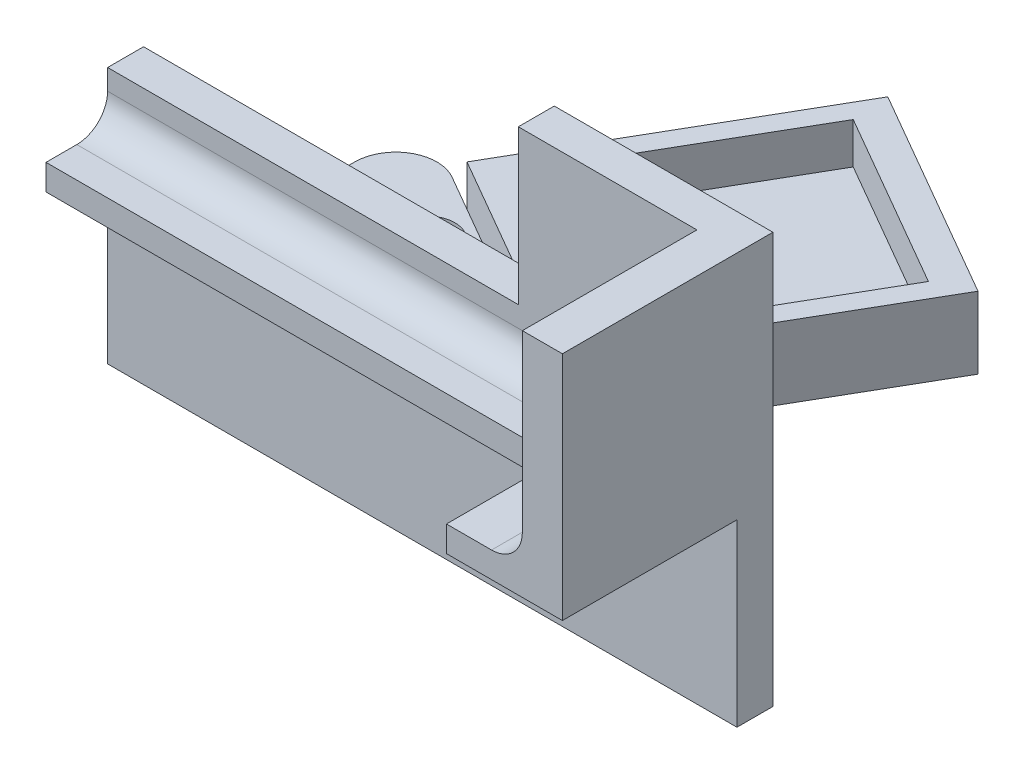
ISO-10303-21;
HEADER;
FILE_DESCRIPTION(('STEP AP214'),'2;1');
FILE_NAME('part.step','',(''),(''),'','','');
FILE_SCHEMA(('AUTOMOTIVE_DESIGN { 1 0 10303 214 1 1 1 1 }'));
ENDSEC;
DATA;
#1=APPLICATION_CONTEXT('core data for automotive mechanical design processes');
#2=APPLICATION_PROTOCOL_DEFINITION('international standard','automotive_design',2000,#1);
#3=PRODUCT_CONTEXT('',#1,'mechanical');
#4=PRODUCT('Part','Part','',(#3));
#5=PRODUCT_RELATED_PRODUCT_CATEGORY('part','',(#4));
#6=PRODUCT_DEFINITION_FORMATION('','',#4);
#7=PRODUCT_DEFINITION_CONTEXT('part definition',#1,'design');
#8=PRODUCT_DEFINITION('design','',#6,#7);
#9=PRODUCT_DEFINITION_SHAPE('','',#8);
#10=(LENGTH_UNIT() NAMED_UNIT(*) SI_UNIT(.MILLI.,.METRE.));
#11=(NAMED_UNIT(*) PLANE_ANGLE_UNIT() SI_UNIT($,.RADIAN.));
#12=(NAMED_UNIT(*) SI_UNIT($,.STERADIAN.) SOLID_ANGLE_UNIT());
#13=UNCERTAINTY_MEASURE_WITH_UNIT(LENGTH_MEASURE(1.E-05),#10,'distance_accuracy_value','');
#14=(GEOMETRIC_REPRESENTATION_CONTEXT(3) GLOBAL_UNCERTAINTY_ASSIGNED_CONTEXT((#13)) GLOBAL_UNIT_ASSIGNED_CONTEXT((#10,
#11,#12)) REPRESENTATION_CONTEXT('',''));
#15=CARTESIAN_POINT('',(0.,0.,0.));
#16=DIRECTION('',(0.,0.,1.));
#17=DIRECTION('',(1.,0.,0.));
#18=AXIS2_PLACEMENT_3D('',#15,#16,#17);
#19=CARTESIAN_POINT('',(0.,5.,18.8412078006943));
#20=DIRECTION('',(0.,1.,0.));
#21=DIRECTION('',(0.,0.,-1.));
#22=AXIS2_PLACEMENT_3D('',#19,#20,#21);
#23=PLANE('',#22);
#24=CARTESIAN_POINT('',(-21.9080301981221,5.,-19.1488880239643));
#25=DIRECTION('',(0.,-1.,0.));
#26=DIRECTION('',(0.,0.,-1.));
#27=AXIS2_PLACEMENT_3D('',#24,#25,#26);
#28=CIRCLE('',#27,2.75);
#29=CARTESIAN_POINT('',(-21.9080301981221,5.,-21.8988880239643));
#30=VERTEX_POINT('',#29);
#31=EDGE_CURVE('E376',#30,#30,#28,.T.);
#32=ORIENTED_EDGE('',*,*,#31,.T.);
#33=EDGE_LOOP('',(#32));
#34=FACE_BOUND('',#33,.T.);
#35=CARTESIAN_POINT('',(-38.3625128700274,5.,-28.6488880239626));
#36=DIRECTION('',(0.,-1.,0.));
#37=DIRECTION('',(0.,0.,-1.));
#38=AXIS2_PLACEMENT_3D('',#35,#36,#37);
#39=CIRCLE('',#38,2.75);
#40=CARTESIAN_POINT('',(-38.3625128700274,5.,-31.3988880239626));
#41=VERTEX_POINT('',#40);
#42=EDGE_CURVE('E350',#41,#41,#39,.T.);
#43=ORIENTED_EDGE('',*,*,#42,.T.);
#44=EDGE_LOOP('',(#43));
#45=FACE_BOUND('',#44,.T.);
#46=DIRECTION('',(0.866025403784442,0.,0.499999999999994));
#47=VECTOR('',#46,1.);
#48=CARTESIAN_POINT('',(-0.731115661883097,5.,-11.0793960996531));
#49=LINE('',#48,#47);
#50=CARTESIAN_POINT('',(-42.3625128700274,5.,-35.1152944845151));
#51=VERTEX_POINT('',#50);
#52=CARTESIAN_POINT('',(-38.8984112548897,5.,-33.1152944845152));
#53=VERTEX_POINT('',#52);
#54=EDGE_CURVE('E400',#51,#53,#49,.T.);
#55=ORIENTED_EDGE('',*,*,#54,.F.);
#56=CARTESIAN_POINT('',(-44.3625128700274,5.,-31.6511928693774));
#57=DIRECTION('',(0.,-1.,0.));
#58=DIRECTION('',(0.,0.,-1.));
#59=AXIS2_PLACEMENT_3D('',#56,#57,#58);
#60=CIRCLE('',#59,4.);
#61=CARTESIAN_POINT('',(-48.3625128700274,5.,-31.6511928693774));
#62=VERTEX_POINT('',#61);
#63=EDGE_CURVE('E342',#62,#51,#60,.T.);
#64=ORIENTED_EDGE('',*,*,#63,.F.);
#65=DIRECTION('',(0.,0.,-1.));
#66=VECTOR('',#65,1.);
#67=CARTESIAN_POINT('',(-48.3625128700274,5.,-38.5793960996528));
#68=LINE('',#67,#66);
#69=CARTESIAN_POINT('',(-48.3625128700274,5.,-15.0793960996531));
#70=VERTEX_POINT('',#69);
#71=EDGE_CURVE('E373',#70,#62,#68,.T.);
#72=ORIENTED_EDGE('',*,*,#71,.F.);
#73=DIRECTION('',(-1.,0.,0.));
#74=VECTOR('',#73,1.);
#75=CARTESIAN_POINT('',(0.,5.,-15.0793960996531));
#76=LINE('',#75,#74);
#77=CARTESIAN_POINT('',(-7.6593188921587,5.,-15.0793960996531));
#78=VERTEX_POINT('',#77);
#79=EDGE_CURVE('E387',#78,#70,#76,.T.);
#80=ORIENTED_EDGE('',*,*,#79,.F.);
#81=CARTESIAN_POINT('',(-18.1138015640631,5.,-21.1152944845153));
#82=VERTEX_POINT('',#81);
#83=EDGE_CURVE('E406',#82,#78,#49,.T.);
#84=ORIENTED_EDGE('',*,*,#83,.F.);
#85=DIRECTION('',(-0.866025403784442,0.,-0.499999999999995));
#86=VECTOR('',#85,1.);
#87=CARTESIAN_POINT('',(-18.1138015640631,5.,-21.1152944845153));
#88=LINE('',#87,#86);
#89=EDGE_CURVE('E403',#82,#53,#88,.T.);
#90=ORIENTED_EDGE('',*,*,#89,.T.);
#91=EDGE_LOOP('',(#55,#64,#72,#80,#84,#90));
#92=FACE_BOUND('',#91,.T.);
#93=ADVANCED_FACE('F37',(#34,#45,#92),#23,.T.);
#94=CARTESIAN_POINT('',(-0.731115661883097,20.,-11.0793960996531));
#95=DIRECTION('',(-0.499999999999994,0.,0.866025403784442));
#96=DIRECTION('',(-0.866025403784442,0.,-0.499999999999994));
#97=AXIS2_PLACEMENT_3D('',#94,#95,#96);
#98=PLANE('',#97);
#99=DIRECTION('',(0.,-1.,0.));
#100=VECTOR('',#99,1.);
#101=CARTESIAN_POINT('',(-38.8984112548897,5.,-33.1152944845152));
#102=LINE('',#101,#100);
#103=CARTESIAN_POINT('',(-38.8984112548897,2.,-33.1152944845152));
#104=VERTEX_POINT('',#103);
#105=EDGE_CURVE('E496',#53,#104,#102,.T.);
#106=ORIENTED_EDGE('',*,*,#105,.T.);
#107=DIRECTION('',(0.866025403784442,0.,0.499999999999995));
#108=VECTOR('',#107,1.);
#109=CARTESIAN_POINT('',(-38.8984112548897,2.,-33.1152944845152));
#110=LINE('',#109,#108);
#111=CARTESIAN_POINT('',(-18.1138015640631,2.,-21.1152944845153));
#112=VERTEX_POINT('',#111);
#113=EDGE_CURVE('E470',#104,#112,#110,.T.);
#114=ORIENTED_EDGE('',*,*,#113,.T.);
#115=DIRECTION('',(0.,1.,0.));
#116=VECTOR('',#115,1.);
#117=CARTESIAN_POINT('',(-18.1138015640631,5.,-21.1152944845153));
#118=LINE('',#117,#116);
#119=EDGE_CURVE('E468',#112,#82,#118,.T.);
#120=ORIENTED_EDGE('',*,*,#119,.T.);
#121=ORIENTED_EDGE('',*,*,#83,.T.);
#122=CARTESIAN_POINT('',(-7.6593188921587,9.,-15.0793960996531));
#123=DIRECTION('',(0.499999999999994,0.,-0.866025403784442));
#124=DIRECTION('',(-0.866025403784442,0.,-0.499999999999994));
#125=AXIS2_PLACEMENT_3D('',#122,#123,#124);
#126=ELLIPSE('',#125,8.00000000000008,4.);
#127=CARTESIAN_POINT('',(-1.6593188921586,7.00000000000002,-11.6152944845154));
#128=VERTEX_POINT('',#127);
#129=EDGE_CURVE('E347',#128,#78,#126,.T.);
#130=ORIENTED_EDGE('',*,*,#129,.F.);
#131=DIRECTION('',(0.,-1.,0.));
#132=VECTOR('',#131,1.);
#133=CARTESIAN_POINT('',(-1.6593188921586,5.,-11.6152944845154));
#134=LINE('',#133,#132);
#135=CARTESIAN_POINT('',(-1.6593188921586,0.,-11.6152944845154));
#136=VERTEX_POINT('',#135);
#137=EDGE_CURVE('E369',#136,#128,#134,.F.);
#138=ORIENTED_EDGE('',*,*,#137,.F.);
#139=DIRECTION('',(0.866025403784442,0.,0.499999999999994));
#140=VECTOR('',#139,1.);
#141=CARTESIAN_POINT('',(-0.731115661883097,0.,-11.0793960996531));
#142=LINE('',#141,#140);
#143=CARTESIAN_POINT('',(-42.3625128700274,0.,-35.1152944845151));
#144=VERTEX_POINT('',#143);
#145=EDGE_CURVE('E302',#144,#136,#142,.T.);
#146=ORIENTED_EDGE('',*,*,#145,.F.);
#147=DIRECTION('',(0.,-1.,0.));
#148=VECTOR('',#147,1.);
#149=CARTESIAN_POINT('',(-42.3625128700274,20.,-35.1152944845151));
#150=LINE('',#149,#148);
#151=EDGE_CURVE('E379',#51,#144,#150,.T.);
#152=ORIENTED_EDGE('',*,*,#151,.F.);
#153=ORIENTED_EDGE('',*,*,#54,.T.);
#154=EDGE_LOOP('',(#106,#114,#120,#121,#130,#138,#146,#152,#153));
#155=FACE_BOUND('',#154,.T.);
#156=ADVANCED_FACE('F461',(#155),#98,.F.);
#157=CARTESIAN_POINT('',(-21.9080301981221,20.,-19.1488880239643));
#158=DIRECTION('',(0.,-1.,0.));
#159=DIRECTION('',(0.,0.,1.));
#160=AXIS2_PLACEMENT_3D('',#157,#158,#159);
#161=CYLINDRICAL_SURFACE('',#160,2.75);
#162=CARTESIAN_POINT('',(-21.9080301981221,0.,-19.1488880239643));
#163=DIRECTION('',(0.,-1.,0.));
#164=DIRECTION('',(0.,0.,-1.));
#165=AXIS2_PLACEMENT_3D('',#162,#163,#164);
#166=CIRCLE('',#165,2.75);
#167=CARTESIAN_POINT('',(-21.9080301981221,0.,-21.8988880239643));
#168=VERTEX_POINT('',#167);
#169=EDGE_CURVE('E297',#168,#168,#166,.T.);
#170=ORIENTED_EDGE('',*,*,#169,.T.);
#171=EDGE_LOOP('',(#170));
#172=FACE_BOUND('',#171,.T.);
#173=ORIENTED_EDGE('',*,*,#31,.F.);
#174=EDGE_LOOP('',(#173));
#175=FACE_BOUND('',#174,.T.);
#176=ADVANCED_FACE('F573',(#172,#175),#161,.F.);
#177=CARTESIAN_POINT('',(-38.3625128700274,20.,-28.6488880239626));
#178=DIRECTION('',(0.,-1.,0.));
#179=DIRECTION('',(0.,0.,1.));
#180=AXIS2_PLACEMENT_3D('',#177,#178,#179);
#181=CYLINDRICAL_SURFACE('',#180,2.75);
#182=CARTESIAN_POINT('',(-38.3625128700274,0.,-28.6488880239626));
#183=DIRECTION('',(0.,-1.,0.));
#184=DIRECTION('',(0.,0.,-1.));
#185=AXIS2_PLACEMENT_3D('',#182,#183,#184);
#186=CIRCLE('',#185,2.75);
#187=CARTESIAN_POINT('',(-38.3625128700274,0.,-31.3988880239626));
#188=VERTEX_POINT('',#187);
#189=EDGE_CURVE('E915',#188,#188,#186,.T.);
#190=ORIENTED_EDGE('',*,*,#189,.T.);
#191=EDGE_LOOP('',(#190));
#192=FACE_BOUND('',#191,.T.);
#193=ORIENTED_EDGE('',*,*,#42,.F.);
#194=EDGE_LOOP('',(#193));
#195=FACE_BOUND('',#194,.T.);
#196=ADVANCED_FACE('F599',(#192,#195),#181,.F.);
#197=CARTESIAN_POINT('',(0.,20.,18.8412078006943));
#198=DIRECTION('',(0.,-1.,0.));
#199=DIRECTION('',(0.,0.,1.));
#200=AXIS2_PLACEMENT_3D('',#197,#198,#199);
#201=PLANE('',#200);
#202=DIRECTION('',(-1.,0.,0.));
#203=VECTOR('',#202,1.);
#204=CARTESIAN_POINT('',(9.02850328135116,20.,-4.57939609965315));
#205=LINE('',#204,#203);
#206=CARTESIAN_POINT('',(-48.3625128700274,20.,-4.57939609965312));
#207=VERTEX_POINT('',#206);
#208=CARTESIAN_POINT('',(6.02850328135116,20.,-4.57939609965314));
#209=VERTEX_POINT('',#208);
#210=EDGE_CURVE('E357',#207,#209,#205,.F.);
#211=ORIENTED_EDGE('',*,*,#210,.F.);
#212=DIRECTION('',(0.,0.,-1.));
#213=VECTOR('',#212,1.);
#214=CARTESIAN_POINT('',(-48.3625128700274,20.,-38.5793960996528));
#215=LINE('',#214,#213);
#216=CARTESIAN_POINT('',(-48.3625128700274,20.,-1.57939609965284));
#217=VERTEX_POINT('',#216);
#218=EDGE_CURVE('E287',#217,#207,#215,.T.);
#219=ORIENTED_EDGE('',*,*,#218,.F.);
#220=DIRECTION('',(-1.,0.,0.));
#221=VECTOR('',#220,1.);
#222=CARTESIAN_POINT('',(1.63748712997262,20.,-1.57939609965286));
#223=LINE('',#222,#221);
#224=CARTESIAN_POINT('',(1.63748712997262,20.,-1.57939609965286));
#225=VERTEX_POINT('',#224);
#226=EDGE_CURVE('E284',#225,#217,#223,.T.);
#227=ORIENTED_EDGE('',*,*,#226,.F.);
#228=DIRECTION('',(0.,0.,-1.));
#229=VECTOR('',#228,1.);
#230=CARTESIAN_POINT('',(1.63748712997262,20.,14.4206039003471));
#231=LINE('',#230,#229);
#232=CARTESIAN_POINT('',(1.63748712997262,20.,9.42060390034713));
#233=VERTEX_POINT('',#232);
#234=EDGE_CURVE('E264',#233,#225,#231,.T.);
#235=ORIENTED_EDGE('',*,*,#234,.F.);
#236=DIRECTION('',(1.,0.,0.));
#237=VECTOR('',#236,1.);
#238=CARTESIAN_POINT('',(0.,20.,9.42060390034713));
#239=LINE('',#238,#237);
#240=CARTESIAN_POINT('',(6.02850328135117,20.,9.42060390034713));
#241=VERTEX_POINT('',#240);
#242=EDGE_CURVE('E417',#233,#241,#239,.T.);
#243=ORIENTED_EDGE('',*,*,#242,.T.);
#244=DIRECTION('',(0.,0.,-1.));
#245=VECTOR('',#244,1.);
#246=CARTESIAN_POINT('',(6.02850328135117,20.,9.42060390034713));
#247=LINE('',#246,#245);
#248=EDGE_CURVE('E360',#209,#241,#247,.F.);
#249=ORIENTED_EDGE('',*,*,#248,.F.);
#250=EDGE_LOOP('',(#211,#219,#227,#235,#243,#249));
#251=FACE_BOUND('',#250,.T.);
#252=ADVANCED_FACE('F602',(#251),#201,.F.);
#253=CARTESIAN_POINT('',(12.9285032813511,20.,-11.0793960996531));
#254=DIRECTION('',(-1.,0.,0.));
#255=DIRECTION('',(0.,0.,-1.));
#256=AXIS2_PLACEMENT_3D('',#253,#254,#255);
#257=PLANE('',#256);
#258=DIRECTION('',(0.,-1.,0.));
#259=VECTOR('',#258,1.);
#260=CARTESIAN_POINT('',(12.9285032813512,20.,9.42060390034713));
#261=LINE('',#260,#259);
#262=CARTESIAN_POINT('',(12.9285032813512,40.,9.42060390034713));
#263=VERTEX_POINT('',#262);
#264=CARTESIAN_POINT('',(12.9285032813512,17.5,9.42060390034713));
#265=VERTEX_POINT('',#264);
#266=EDGE_CURVE('E415',#263,#265,#261,.T.);
#267=ORIENTED_EDGE('',*,*,#266,.T.);
#268=DIRECTION('',(0.,0.,1.));
#269=VECTOR('',#268,1.);
#270=CARTESIAN_POINT('',(12.9285032813512,17.5,-7.57939609965287));
#271=LINE('',#270,#269);
#272=CARTESIAN_POINT('',(12.9285032813512,17.5,-7.57939609965287));
#273=VERTEX_POINT('',#272);
#274=EDGE_CURVE('E273',#273,#265,#271,.T.);
#275=ORIENTED_EDGE('',*,*,#274,.F.);
#276=DIRECTION('',(0.,-1.,0.));
#277=VECTOR('',#276,1.);
#278=CARTESIAN_POINT('',(12.9285032813512,20.,-7.57939609965287));
#279=LINE('',#278,#277);
#280=CARTESIAN_POINT('',(12.9285032813512,0.,-7.57939609965287));
#281=VERTEX_POINT('',#280);
#282=EDGE_CURVE('E275',#273,#281,#279,.T.);
#283=ORIENTED_EDGE('',*,*,#282,.T.);
#284=DIRECTION('',(0.,0.,1.));
#285=VECTOR('',#284,1.);
#286=CARTESIAN_POINT('',(12.9285032813511,0.,-11.0793960996531));
#287=LINE('',#286,#285);
#288=CARTESIAN_POINT('',(12.9285032813511,0.,-11.0793960996531));
#289=VERTEX_POINT('',#288);
#290=EDGE_CURVE('E307',#289,#281,#287,.T.);
#291=ORIENTED_EDGE('',*,*,#290,.F.);
#292=DIRECTION('',(0.,-1.,0.));
#293=VECTOR('',#292,1.);
#294=CARTESIAN_POINT('',(12.9285032813511,20.,-11.0793960996531));
#295=LINE('',#294,#293);
#296=CARTESIAN_POINT('',(12.9285032813512,40.,-11.0793960996531));
#297=VERTEX_POINT('',#296);
#298=EDGE_CURVE('E315',#297,#289,#295,.T.);
#299=ORIENTED_EDGE('',*,*,#298,.F.);
#300=DIRECTION('',(0.,0.,1.));
#301=VECTOR('',#300,1.);
#302=CARTESIAN_POINT('',(12.9285032813512,40.,14.4206039003471));
#303=LINE('',#302,#301);
#304=EDGE_CURVE('E425',#297,#263,#303,.T.);
#305=ORIENTED_EDGE('',*,*,#304,.T.);
#306=EDGE_LOOP('',(#267,#275,#283,#291,#299,#305));
#307=FACE_BOUND('',#306,.T.);
#308=ADVANCED_FACE('F327',(#307),#257,.F.);
#309=CARTESIAN_POINT('',(1.63748712997262,17.5,14.4206039003471));
#310=DIRECTION('',(-1.,0.,0.));
#311=DIRECTION('',(0.,0.,-1.));
#312=AXIS2_PLACEMENT_3D('',#309,#310,#311);
#313=PLANE('',#312);
#314=ORIENTED_EDGE('',*,*,#234,.T.);
#315=DIRECTION('',(0.,1.,0.));
#316=VECTOR('',#315,1.);
#317=CARTESIAN_POINT('',(1.63748712997262,17.5,-1.57939609965286));
#318=LINE('',#317,#316);
#319=CARTESIAN_POINT('',(1.63748712997262,17.5,-1.57939609965286));
#320=VERTEX_POINT('',#319);
#321=EDGE_CURVE('E916',#320,#225,#318,.T.);
#322=ORIENTED_EDGE('',*,*,#321,.F.);
#323=DIRECTION('',(0.,0.,-1.));
#324=VECTOR('',#323,1.);
#325=CARTESIAN_POINT('',(1.63748712997262,17.5,14.4206039003471));
#326=LINE('',#325,#324);
#327=CARTESIAN_POINT('',(1.63748712997262,17.5,9.42060390034713));
#328=VERTEX_POINT('',#327);
#329=EDGE_CURVE('E267',#328,#320,#326,.T.);
#330=ORIENTED_EDGE('',*,*,#329,.F.);
#331=DIRECTION('',(0.,-1.,0.));
#332=VECTOR('',#331,1.);
#333=CARTESIAN_POINT('',(1.63748712997262,17.5,9.42060390034713));
#334=LINE('',#333,#332);
#335=EDGE_CURVE('E422',#233,#328,#334,.T.);
#336=ORIENTED_EDGE('',*,*,#335,.F.);
#337=EDGE_LOOP('',(#314,#322,#330,#336));
#338=FACE_BOUND('',#337,.T.);
#339=ADVANCED_FACE('F592',(#338),#313,.T.);
#340=CARTESIAN_POINT('',(0.,17.5,18.8412078006943));
#341=DIRECTION('',(0.,1.,0.));
#342=DIRECTION('',(0.,0.,-1.));
#343=AXIS2_PLACEMENT_3D('',#340,#341,#342);
#344=PLANE('',#343);
#345=DIRECTION('',(-1.,0.,0.));
#346=VECTOR('',#345,1.);
#347=CARTESIAN_POINT('',(0.,17.5,9.42060390034713));
#348=LINE('',#347,#346);
#349=EDGE_CURVE('E420',#265,#328,#348,.T.);
#350=ORIENTED_EDGE('',*,*,#349,.T.);
#351=ORIENTED_EDGE('',*,*,#329,.T.);
#352=DIRECTION('',(-1.,0.,0.));
#353=VECTOR('',#352,1.);
#354=CARTESIAN_POINT('',(1.63748712997262,17.5,-1.57939609965286));
#355=LINE('',#354,#353);
#356=CARTESIAN_POINT('',(-48.3625128700274,17.5,-1.57939609965284));
#357=VERTEX_POINT('',#356);
#358=EDGE_CURVE('E456',#320,#357,#355,.T.);
#359=ORIENTED_EDGE('',*,*,#358,.T.);
#360=DIRECTION('',(0.,0.,-1.));
#361=VECTOR('',#360,1.);
#362=CARTESIAN_POINT('',(-48.3625128700274,17.5,-1.57939609965284));
#363=LINE('',#362,#361);
#364=CARTESIAN_POINT('',(-48.3625128700274,17.5,-7.57939609965283));
#365=VERTEX_POINT('',#364);
#366=EDGE_CURVE('E274',#357,#365,#363,.T.);
#367=ORIENTED_EDGE('',*,*,#366,.T.);
#368=DIRECTION('',(1.,0.,0.));
#369=VECTOR('',#368,1.);
#370=CARTESIAN_POINT('',(-48.3625128700274,17.5,-7.57939609965283));
#371=LINE('',#370,#369);
#372=EDGE_CURVE('E270',#365,#273,#371,.T.);
#373=ORIENTED_EDGE('',*,*,#372,.T.);
#374=ORIENTED_EDGE('',*,*,#274,.T.);
#375=EDGE_LOOP('',(#350,#351,#359,#367,#373,#374));
#376=FACE_BOUND('',#375,.T.);
#377=ADVANCED_FACE('F453',(#376),#344,.F.);
#378=CARTESIAN_POINT('',(9.02850328135117,40.,14.4206039003471));
#379=DIRECTION('',(1.,0.,0.));
#380=DIRECTION('',(0.,0.,1.));
#381=AXIS2_PLACEMENT_3D('',#378,#379,#380);
#382=PLANE('',#381);
#383=DIRECTION('',(0.,1.,0.));
#384=VECTOR('',#383,1.);
#385=CARTESIAN_POINT('',(9.02850328135117,40.,9.42060390034713));
#386=LINE('',#385,#384);
#387=CARTESIAN_POINT('',(9.02850328135117,23.,9.42060390034713));
#388=VERTEX_POINT('',#387);
#389=CARTESIAN_POINT('',(9.02850328135117,40.,9.42060390034713));
#390=VERTEX_POINT('',#389);
#391=EDGE_CURVE('E372',#388,#390,#386,.T.);
#392=ORIENTED_EDGE('',*,*,#391,.T.);
#393=DIRECTION('',(0.,0.,-1.));
#394=VECTOR('',#393,1.);
#395=CARTESIAN_POINT('',(9.02850328135117,40.,14.4206039003471));
#396=LINE('',#395,#394);
#397=CARTESIAN_POINT('',(9.02850328135116,40.,-7.57939609965315));
#398=VERTEX_POINT('',#397);
#399=EDGE_CURVE('E258',#390,#398,#396,.T.);
#400=ORIENTED_EDGE('',*,*,#399,.T.);
#401=DIRECTION('',(0.,-1.,0.));
#402=VECTOR('',#401,1.);
#403=CARTESIAN_POINT('',(9.02850328135116,40.,-7.57939609965315));
#404=LINE('',#403,#402);
#405=CARTESIAN_POINT('',(9.02850328135116,23.,-7.57939609965315));
#406=VERTEX_POINT('',#405);
#407=EDGE_CURVE('E250',#398,#406,#404,.T.);
#408=ORIENTED_EDGE('',*,*,#407,.T.);
#409=DIRECTION('',(0.,0.,-1.));
#410=VECTOR('',#409,1.);
#411=CARTESIAN_POINT('',(9.02850328135116,23.,-7.57939609965315));
#412=LINE('',#411,#410);
#413=EDGE_CURVE('E320',#388,#406,#412,.T.);
#414=ORIENTED_EDGE('',*,*,#413,.F.);
#415=EDGE_LOOP('',(#392,#400,#408,#414));
#416=FACE_BOUND('',#415,.T.);
#417=ADVANCED_FACE('F430',(#416),#382,.F.);
#418=CARTESIAN_POINT('',(0.,40.,18.8412078006943));
#419=DIRECTION('',(0.,-1.,0.));
#420=DIRECTION('',(0.,0.,1.));
#421=AXIS2_PLACEMENT_3D('',#418,#419,#420);
#422=PLANE('',#421);
#423=DIRECTION('',(-1.,0.,0.));
#424=VECTOR('',#423,1.);
#425=CARTESIAN_POINT('',(9.02850328135116,40.,-7.57939609965315));
#426=LINE('',#425,#424);
#427=CARTESIAN_POINT('',(-8.36251287002739,40.,-7.57939609965314));
#428=VERTEX_POINT('',#427);
#429=EDGE_CURVE('E252',#398,#428,#426,.T.);
#430=ORIENTED_EDGE('',*,*,#429,.F.);
#431=ORIENTED_EDGE('',*,*,#399,.F.);
#432=DIRECTION('',(1.,0.,0.));
#433=VECTOR('',#432,1.);
#434=CARTESIAN_POINT('',(0.,40.,9.42060390034713));
#435=LINE('',#434,#433);
#436=EDGE_CURVE('E316',#390,#263,#435,.T.);
#437=ORIENTED_EDGE('',*,*,#436,.T.);
#438=ORIENTED_EDGE('',*,*,#304,.F.);
#439=DIRECTION('',(1.,0.,0.));
#440=VECTOR('',#439,1.);
#441=CARTESIAN_POINT('',(6.77850328135114,40.,-11.0793960996531));
#442=LINE('',#441,#440);
#443=CARTESIAN_POINT('',(-8.36251287002739,40.,-11.0793960996531));
#444=VERTEX_POINT('',#443);
#445=EDGE_CURVE('E249',#444,#297,#442,.T.);
#446=ORIENTED_EDGE('',*,*,#445,.F.);
#447=DIRECTION('',(0.,0.,-1.));
#448=VECTOR('',#447,1.);
#449=CARTESIAN_POINT('',(-8.36251287002739,40.,-1.07939609965313));
#450=LINE('',#449,#448);
#451=EDGE_CURVE('E438',#428,#444,#450,.T.);
#452=ORIENTED_EDGE('',*,*,#451,.F.);
#453=EDGE_LOOP('',(#430,#431,#437,#438,#446,#452));
#454=FACE_BOUND('',#453,.T.);
#455=ADVANCED_FACE('F435',(#454),#422,.F.);
#456=CARTESIAN_POINT('',(0.,0.,18.8412078006943));
#457=DIRECTION('',(0.,-1.,0.));
#458=DIRECTION('',(0.,0.,1.));
#459=AXIS2_PLACEMENT_3D('',#456,#457,#458);
#460=PLANE('',#459);
#461=ORIENTED_EDGE('',*,*,#169,.F.);
#462=EDGE_LOOP('',(#461));
#463=FACE_BOUND('',#462,.T.);
#464=ORIENTED_EDGE('',*,*,#145,.T.);
#465=CARTESIAN_POINT('',(0.340681107841382,0.,-15.0793960996531));
#466=DIRECTION('',(0.,1.,0.));
#467=DIRECTION('',(0.,0.,1.));
#468=AXIS2_PLACEMENT_3D('',#465,#466,#467);
#469=CIRCLE('',#468,4.);
#470=CARTESIAN_POINT('',(0.340681107841384,0.,-11.0793960996531));
#471=VERTEX_POINT('',#470);
#472=EDGE_CURVE('E336',#471,#136,#469,.F.);
#473=ORIENTED_EDGE('',*,*,#472,.F.);
#474=DIRECTION('',(1.,0.,0.));
#475=VECTOR('',#474,1.);
#476=CARTESIAN_POINT('',(-0.731115661883097,0.,-11.0793960996531));
#477=LINE('',#476,#475);
#478=EDGE_CURVE('E305',#471,#289,#477,.T.);
#479=ORIENTED_EDGE('',*,*,#478,.T.);
#480=ORIENTED_EDGE('',*,*,#290,.T.);
#481=DIRECTION('',(-1.,0.,0.));
#482=VECTOR('',#481,1.);
#483=CARTESIAN_POINT('',(-48.3625128700274,0.,-7.57939609965283));
#484=LINE('',#483,#482);
#485=CARTESIAN_POINT('',(-48.3625128700274,0.,-7.57939609965283));
#486=VERTEX_POINT('',#485);
#487=EDGE_CURVE('E291',#281,#486,#484,.T.);
#488=ORIENTED_EDGE('',*,*,#487,.T.);
#489=DIRECTION('',(0.,0.,-1.));
#490=VECTOR('',#489,1.);
#491=CARTESIAN_POINT('',(-48.3625128700274,0.,-38.5793960996528));
#492=LINE('',#491,#490);
#493=CARTESIAN_POINT('',(-48.3625128700274,0.,-31.6511928693774));
#494=VERTEX_POINT('',#493);
#495=EDGE_CURVE('E299',#486,#494,#492,.T.);
#496=ORIENTED_EDGE('',*,*,#495,.T.);
#497=CARTESIAN_POINT('',(-44.3625128700274,0.,-31.6511928693774));
#498=DIRECTION('',(0.,1.,0.));
#499=DIRECTION('',(0.,0.,1.));
#500=AXIS2_PLACEMENT_3D('',#497,#498,#499);
#501=CIRCLE('',#500,4.);
#502=EDGE_CURVE('E382',#144,#494,#501,.T.);
#503=ORIENTED_EDGE('',*,*,#502,.F.);
#504=EDGE_LOOP('',(#464,#473,#479,#480,#488,#496,#503));
#505=FACE_BOUND('',#504,.T.);
#506=ORIENTED_EDGE('',*,*,#189,.F.);
#507=EDGE_LOOP('',(#506));
#508=FACE_BOUND('',#507,.T.);
#509=ADVANCED_FACE('F333',(#463,#505,#508),#460,.T.);
#510=CARTESIAN_POINT('',(-48.3625128700274,20.,-38.5793960996528));
#511=DIRECTION('',(1.,0.,0.));
#512=DIRECTION('',(0.,0.,1.));
#513=AXIS2_PLACEMENT_3D('',#510,#511,#512);
#514=PLANE('',#513);
#515=DIRECTION('',(0.,-1.,0.));
#516=VECTOR('',#515,1.);
#517=CARTESIAN_POINT('',(-48.3625128700274,40.,-11.0793960996531));
#518=LINE('',#517,#516);
#519=CARTESIAN_POINT('',(-48.3625128700274,25.,-11.0793960996531));
#520=VERTEX_POINT('',#519);
#521=CARTESIAN_POINT('',(-48.3625128700274,9.,-11.0793960996531));
#522=VERTEX_POINT('',#521);
#523=EDGE_CURVE('E41',#520,#522,#518,.T.);
#524=ORIENTED_EDGE('',*,*,#523,.T.);
#525=CARTESIAN_POINT('',(-48.3625128700274,9.,-15.0793960996531));
#526=DIRECTION('',(-1.,0.,0.));
#527=DIRECTION('',(0.,0.,1.));
#528=AXIS2_PLACEMENT_3D('',#525,#526,#527);
#529=CIRCLE('',#528,4.);
#530=EDGE_CURVE('E340',#70,#522,#529,.T.);
#531=ORIENTED_EDGE('',*,*,#530,.F.);
#532=ORIENTED_EDGE('',*,*,#71,.T.);
#533=DIRECTION('',(0.,-1.,0.));
#534=VECTOR('',#533,1.);
#535=CARTESIAN_POINT('',(-48.3625128700274,20.,-31.6511928693774));
#536=LINE('',#535,#534);
#537=EDGE_CURVE('E385',#494,#62,#536,.F.);
#538=ORIENTED_EDGE('',*,*,#537,.F.);
#539=ORIENTED_EDGE('',*,*,#495,.F.);
#540=DIRECTION('',(0.,-1.,0.));
#541=VECTOR('',#540,1.);
#542=CARTESIAN_POINT('',(-48.3625128700274,20.,-7.57939609965283));
#543=LINE('',#542,#541);
#544=EDGE_CURVE('E290',#365,#486,#543,.T.);
#545=ORIENTED_EDGE('',*,*,#544,.F.);
#546=ORIENTED_EDGE('',*,*,#366,.F.);
#547=DIRECTION('',(0.,1.,0.));
#548=VECTOR('',#547,1.);
#549=CARTESIAN_POINT('',(-48.3625128700274,17.5,-1.57939609965284));
#550=LINE('',#549,#548);
#551=EDGE_CURVE('E457',#357,#217,#550,.T.);
#552=ORIENTED_EDGE('',*,*,#551,.T.);
#553=ORIENTED_EDGE('',*,*,#218,.T.);
#554=CARTESIAN_POINT('',(-48.3625128700274,23.,-4.57939609965312));
#555=DIRECTION('',(-1.,0.,0.));
#556=DIRECTION('',(0.,0.,1.));
#557=AXIS2_PLACEMENT_3D('',#554,#555,#556);
#558=CIRCLE('',#557,3.);
#559=CARTESIAN_POINT('',(-48.3625128700274,23.,-7.57939609965311));
#560=VERTEX_POINT('',#559);
#561=EDGE_CURVE('E367',#560,#207,#558,.T.);
#562=ORIENTED_EDGE('',*,*,#561,.F.);
#563=DIRECTION('',(0.,-1.,0.));
#564=VECTOR('',#563,1.);
#565=CARTESIAN_POINT('',(-48.3625128700274,40.,-7.57939609965311));
#566=LINE('',#565,#564);
#567=CARTESIAN_POINT('',(-48.3625128700274,25.,-7.57939609965311));
#568=VERTEX_POINT('',#567);
#569=EDGE_CURVE('E242',#568,#560,#566,.T.);
#570=ORIENTED_EDGE('',*,*,#569,.F.);
#571=DIRECTION('',(0.,0.,-1.));
#572=VECTOR('',#571,1.);
#573=CARTESIAN_POINT('',(-48.3625128700274,25.,-1.07939609965311));
#574=LINE('',#573,#572);
#575=EDGE_CURVE('E231',#568,#520,#574,.T.);
#576=ORIENTED_EDGE('',*,*,#575,.T.);
#577=EDGE_LOOP('',(#524,#531,#532,#538,#539,#545,#546,#552,#553,#562,#570,#576));
#578=FACE_BOUND('',#577,.T.);
#579=ADVANCED_FACE('F239',(#578),#514,.F.);
#580=CARTESIAN_POINT('',(-0.731115661883097,20.,-11.0793960996531));
#581=DIRECTION('',(0.,0.,1.));
#582=DIRECTION('',(-1.,0.,0.));
#583=AXIS2_PLACEMENT_3D('',#580,#581,#582);
#584=PLANE('',#583);
#585=ORIENTED_EDGE('',*,*,#445,.T.);
#586=ORIENTED_EDGE('',*,*,#298,.T.);
#587=ORIENTED_EDGE('',*,*,#478,.F.);
#588=DIRECTION('',(0.,-1.,0.));
#589=VECTOR('',#588,1.);
#590=CARTESIAN_POINT('',(0.340681107841384,0.,-11.0793960996531));
#591=LINE('',#590,#589);
#592=CARTESIAN_POINT('',(0.340681107841384,9.,-11.0793960996531));
#593=VERTEX_POINT('',#592);
#594=EDGE_CURVE('E337',#593,#471,#591,.T.);
#595=ORIENTED_EDGE('',*,*,#594,.F.);
#596=DIRECTION('',(-1.,0.,0.));
#597=VECTOR('',#596,1.);
#598=CARTESIAN_POINT('',(-0.731115661883097,9.,-11.0793960996531));
#599=LINE('',#598,#597);
#600=EDGE_CURVE('E247',#522,#593,#599,.F.);
#601=ORIENTED_EDGE('',*,*,#600,.F.);
#602=ORIENTED_EDGE('',*,*,#523,.F.);
#603=DIRECTION('',(1.,0.,0.));
#604=VECTOR('',#603,1.);
#605=CARTESIAN_POINT('',(-48.3625128700274,25.,-11.0793960996531));
#606=LINE('',#605,#604);
#607=CARTESIAN_POINT('',(-8.36251287002739,25.,-11.0793960996531));
#608=VERTEX_POINT('',#607);
#609=EDGE_CURVE('E227',#520,#608,#606,.T.);
#610=ORIENTED_EDGE('',*,*,#609,.T.);
#611=DIRECTION('',(0.,1.,0.));
#612=VECTOR('',#611,1.);
#613=CARTESIAN_POINT('',(-8.36251287002739,40.,-11.0793960996531));
#614=LINE('',#613,#612);
#615=EDGE_CURVE('E235',#608,#444,#614,.T.);
#616=ORIENTED_EDGE('',*,*,#615,.T.);
#617=EDGE_LOOP('',(#585,#586,#587,#595,#601,#602,#610,#616));
#618=FACE_BOUND('',#617,.T.);
#619=ADVANCED_FACE('F244',(#618),#584,.F.);
#620=CARTESIAN_POINT('',(-48.3625128700274,20.,-7.57939609965283));
#621=DIRECTION('',(0.,0.,-1.));
#622=DIRECTION('',(1.,0.,0.));
#623=AXIS2_PLACEMENT_3D('',#620,#621,#622);
#624=PLANE('',#623);
#625=ORIENTED_EDGE('',*,*,#544,.T.);
#626=ORIENTED_EDGE('',*,*,#487,.F.);
#627=ORIENTED_EDGE('',*,*,#282,.F.);
#628=ORIENTED_EDGE('',*,*,#372,.F.);
#629=EDGE_LOOP('',(#625,#626,#627,#628));
#630=FACE_BOUND('',#629,.T.);
#631=ADVANCED_FACE('F330',(#630),#624,.F.);
#632=CARTESIAN_POINT('',(1.63748712997262,17.5,-1.57939609965286));
#633=DIRECTION('',(0.,0.,1.));
#634=DIRECTION('',(-1.,0.,0.));
#635=AXIS2_PLACEMENT_3D('',#632,#633,#634);
#636=PLANE('',#635);
#637=ORIENTED_EDGE('',*,*,#226,.T.);
#638=ORIENTED_EDGE('',*,*,#551,.F.);
#639=ORIENTED_EDGE('',*,*,#358,.F.);
#640=ORIENTED_EDGE('',*,*,#321,.T.);
#641=EDGE_LOOP('',(#637,#638,#639,#640));
#642=FACE_BOUND('',#641,.T.);
#643=ADVANCED_FACE('F587',(#642),#636,.T.);
#644=CARTESIAN_POINT('',(9.02850328135116,40.,-7.57939609965315));
#645=DIRECTION('',(0.,0.,-1.));
#646=DIRECTION('',(1.,0.,0.));
#647=AXIS2_PLACEMENT_3D('',#644,#645,#646);
#648=PLANE('',#647);
#649=DIRECTION('',(1.,0.,0.));
#650=VECTOR('',#649,1.);
#651=CARTESIAN_POINT('',(9.02850328135116,25.,-7.57939609965315));
#652=LINE('',#651,#650);
#653=CARTESIAN_POINT('',(-8.36251287002739,25.,-7.57939609965314));
#654=VERTEX_POINT('',#653);
#655=EDGE_CURVE('E47',#568,#654,#652,.T.);
#656=ORIENTED_EDGE('',*,*,#655,.F.);
#657=ORIENTED_EDGE('',*,*,#569,.T.);
#658=DIRECTION('',(-1.,0.,0.));
#659=VECTOR('',#658,1.);
#660=CARTESIAN_POINT('',(-48.3625128700274,23.,-7.57939609965311));
#661=LINE('',#660,#659);
#662=EDGE_CURVE('E363',#406,#560,#661,.T.);
#663=ORIENTED_EDGE('',*,*,#662,.F.);
#664=ORIENTED_EDGE('',*,*,#407,.F.);
#665=ORIENTED_EDGE('',*,*,#429,.T.);
#666=DIRECTION('',(0.,1.,0.));
#667=VECTOR('',#666,1.);
#668=CARTESIAN_POINT('',(-8.36251287002739,40.,-7.57939609965314));
#669=LINE('',#668,#667);
#670=EDGE_CURVE('E11',#654,#428,#669,.T.);
#671=ORIENTED_EDGE('',*,*,#670,.F.);
#672=EDGE_LOOP('',(#656,#657,#663,#664,#665,#671));
#673=FACE_BOUND('',#672,.T.);
#674=ADVANCED_FACE('F441',(#673),#648,.F.);
#675=CARTESIAN_POINT('',(0.,0.,9.42060390034713));
#676=DIRECTION('',(0.,0.,1.));
#677=DIRECTION('',(-1.,0.,0.));
#678=AXIS2_PLACEMENT_3D('',#675,#676,#677);
#679=PLANE('',#678);
#680=ORIENTED_EDGE('',*,*,#242,.F.);
#681=ORIENTED_EDGE('',*,*,#335,.T.);
#682=ORIENTED_EDGE('',*,*,#349,.F.);
#683=ORIENTED_EDGE('',*,*,#266,.F.);
#684=ORIENTED_EDGE('',*,*,#436,.F.);
#685=ORIENTED_EDGE('',*,*,#391,.F.);
#686=CARTESIAN_POINT('',(6.02850328135117,23.,9.42060390034713));
#687=DIRECTION('',(0.,0.,-1.));
#688=DIRECTION('',(-1.,0.,0.));
#689=AXIS2_PLACEMENT_3D('',#686,#687,#688);
#690=CIRCLE('',#689,3.);
#691=EDGE_CURVE('E365',#241,#388,#690,.F.);
#692=ORIENTED_EDGE('',*,*,#691,.F.);
#693=EDGE_LOOP('',(#680,#681,#682,#683,#684,#685,#692));
#694=FACE_BOUND('',#693,.T.);
#695=ADVANCED_FACE('F448',(#694),#679,.T.);
#696=CARTESIAN_POINT('',(9.02850328135116,23.,-4.57939609965315));
#697=DIRECTION('',(1.,0.,0.));
#698=DIRECTION('',(0.,0.,1.));
#699=AXIS2_PLACEMENT_3D('',#696,#697,#698);
#700=CYLINDRICAL_SURFACE('',#699,3.);
#701=ORIENTED_EDGE('',*,*,#561,.T.);
#702=ORIENTED_EDGE('',*,*,#210,.T.);
#703=CARTESIAN_POINT('',(6.02850328135116,23.,-4.57939609965314));
#704=DIRECTION('',(-0.707106781186548,0.,-0.707106781186547));
#705=DIRECTION('',(-0.707106781186547,0.,0.707106781186548));
#706=AXIS2_PLACEMENT_3D('',#703,#704,#705);
#707=ELLIPSE('',#706,4.24264068711928,3.);
#708=EDGE_CURVE('E370',#209,#406,#707,.F.);
#709=ORIENTED_EDGE('',*,*,#708,.T.);
#710=ORIENTED_EDGE('',*,*,#662,.T.);
#711=EDGE_LOOP('',(#701,#702,#709,#710));
#712=FACE_BOUND('',#711,.T.);
#713=ADVANCED_FACE('F582',(#712),#700,.F.);
#714=CARTESIAN_POINT('',(6.02850328135117,23.,14.4206039003471));
#715=DIRECTION('',(0.,0.,1.));
#716=DIRECTION('',(-1.,0.,0.));
#717=AXIS2_PLACEMENT_3D('',#714,#715,#716);
#718=CYLINDRICAL_SURFACE('',#717,3.);
#719=ORIENTED_EDGE('',*,*,#691,.T.);
#720=ORIENTED_EDGE('',*,*,#413,.T.);
#721=ORIENTED_EDGE('',*,*,#708,.F.);
#722=ORIENTED_EDGE('',*,*,#248,.T.);
#723=EDGE_LOOP('',(#719,#720,#721,#722));
#724=FACE_BOUND('',#723,.T.);
#725=ADVANCED_FACE('F444',(#724),#718,.F.);
#726=CARTESIAN_POINT('',(-44.3625128700274,20.,-31.6511928693774));
#727=DIRECTION('',(0.,-1.,0.));
#728=DIRECTION('',(0.,0.,1.));
#729=AXIS2_PLACEMENT_3D('',#726,#727,#728);
#730=CYLINDRICAL_SURFACE('',#729,4.);
#731=ORIENTED_EDGE('',*,*,#63,.T.);
#732=ORIENTED_EDGE('',*,*,#151,.T.);
#733=ORIENTED_EDGE('',*,*,#502,.T.);
#734=ORIENTED_EDGE('',*,*,#537,.T.);
#735=EDGE_LOOP('',(#731,#732,#733,#734));
#736=FACE_BOUND('',#735,.T.);
#737=ADVANCED_FACE('F393',(#736),#730,.T.);
#738=CARTESIAN_POINT('',(0.,9.,-15.0793960996531));
#739=DIRECTION('',(-1.,0.,0.));
#740=DIRECTION('',(0.,0.,-1.));
#741=AXIS2_PLACEMENT_3D('',#738,#739,#740);
#742=CYLINDRICAL_SURFACE('',#741,4.);
#743=ORIENTED_EDGE('',*,*,#79,.T.);
#744=ORIENTED_EDGE('',*,*,#530,.T.);
#745=ORIENTED_EDGE('',*,*,#600,.T.);
#746=CARTESIAN_POINT('',(0.340681107841382,9.,-15.0793960996531));
#747=DIRECTION('',(0.707106781186547,-0.707106781186547,0.));
#748=DIRECTION('',(-0.707106781186547,-0.707106781186547,0.));
#749=AXIS2_PLACEMENT_3D('',#746,#747,#748);
#750=ELLIPSE('',#749,5.65685424949238,4.);
#751=EDGE_CURVE('E349',#593,#128,#750,.T.);
#752=ORIENTED_EDGE('',*,*,#751,.T.);
#753=ORIENTED_EDGE('',*,*,#129,.T.);
#754=EDGE_LOOP('',(#743,#744,#745,#752,#753));
#755=FACE_BOUND('',#754,.T.);
#756=ADVANCED_FACE('F39',(#755),#742,.F.);
#757=CARTESIAN_POINT('',(0.340681107841382,20.,-15.0793960996531));
#758=DIRECTION('',(0.,1.,0.));
#759=DIRECTION('',(0.,0.,-1.));
#760=AXIS2_PLACEMENT_3D('',#757,#758,#759);
#761=CYLINDRICAL_SURFACE('',#760,4.);
#762=ORIENTED_EDGE('',*,*,#751,.F.);
#763=ORIENTED_EDGE('',*,*,#594,.T.);
#764=ORIENTED_EDGE('',*,*,#472,.T.);
#765=ORIENTED_EDGE('',*,*,#137,.T.);
#766=EDGE_LOOP('',(#762,#763,#764,#765));
#767=FACE_BOUND('',#766,.T.);
#768=ADVANCED_FACE('F462',(#767),#761,.F.);
#769=CARTESIAN_POINT('',(-23.8984112548898,5.,-59.0960565980484));
#770=DIRECTION('',(0.866025403784442,0.,0.499999999999995));
#771=DIRECTION('',(-0.499999999999995,0.,0.866025403784442));
#772=AXIS2_PLACEMENT_3D('',#769,#770,#771);
#773=PLANE('',#772);
#774=ORIENTED_EDGE('',*,*,#105,.F.);
#775=DIRECTION('',(0.,-1.,0.));
#776=VECTOR('',#775,1.);
#777=CARTESIAN_POINT('',(-38.8984112548897,9.,-33.1152944845152));
#778=LINE('',#777,#776);
#779=CARTESIAN_POINT('',(-38.8984112548897,9.,-33.1152944845152));
#780=VERTEX_POINT('',#779);
#781=EDGE_CURVE('E481',#780,#53,#778,.T.);
#782=ORIENTED_EDGE('',*,*,#781,.F.);
#783=DIRECTION('',(0.499999999999995,0.,-0.866025403784442));
#784=VECTOR('',#783,1.);
#785=CARTESIAN_POINT('',(-38.8984112548897,9.,-33.1152944845152));
#786=LINE('',#785,#784);
#787=CARTESIAN_POINT('',(-23.8984112548898,9.,-59.0960565980484));
#788=VERTEX_POINT('',#787);
#789=EDGE_CURVE('E521',#780,#788,#786,.T.);
#790=ORIENTED_EDGE('',*,*,#789,.T.);
#791=DIRECTION('',(0.,-1.,0.));
#792=VECTOR('',#791,1.);
#793=CARTESIAN_POINT('',(-23.8984112548898,5.,-59.0960565980484));
#794=LINE('',#793,#792);
#795=CARTESIAN_POINT('',(-23.8984112548898,2.,-59.0960565980484));
#796=VERTEX_POINT('',#795);
#797=EDGE_CURVE('E473',#788,#796,#794,.T.);
#798=ORIENTED_EDGE('',*,*,#797,.T.);
#799=DIRECTION('',(-0.499999999999995,0.,0.866025403784442));
#800=VECTOR('',#799,1.);
#801=CARTESIAN_POINT('',(-23.8984112548898,2.,-59.0960565980484));
#802=LINE('',#801,#800);
#803=EDGE_CURVE('E351',#796,#104,#802,.T.);
#804=ORIENTED_EDGE('',*,*,#803,.T.);
#805=EDGE_LOOP('',(#774,#782,#790,#798,#804));
#806=FACE_BOUND('',#805,.T.);
#807=ADVANCED_FACE('F510',(#806),#773,.F.);
#808=CARTESIAN_POINT('',(-23.8984112548898,2.,-59.0960565980484));
#809=DIRECTION('',(0.,1.,0.));
#810=DIRECTION('',(0.,0.,-1.));
#811=AXIS2_PLACEMENT_3D('',#808,#809,#810);
#812=PLANE('',#811);
#813=ORIENTED_EDGE('',*,*,#113,.F.);
#814=ORIENTED_EDGE('',*,*,#803,.F.);
#815=DIRECTION('',(0.866025403784442,0.,0.499999999999995));
#816=VECTOR('',#815,1.);
#817=CARTESIAN_POINT('',(-23.8984112548898,2.,-59.0960565980484));
#818=LINE('',#817,#816);
#819=CARTESIAN_POINT('',(-3.11380156406323,2.,-47.0960565980486));
#820=VERTEX_POINT('',#819);
#821=EDGE_CURVE('E499',#796,#820,#818,.T.);
#822=ORIENTED_EDGE('',*,*,#821,.T.);
#823=DIRECTION('',(-0.499999999999995,0.,0.866025403784442));
#824=VECTOR('',#823,1.);
#825=CARTESIAN_POINT('',(-3.11380156406323,2.,-47.0960565980486));
#826=LINE('',#825,#824);
#827=EDGE_CURVE('E505',#820,#112,#826,.T.);
#828=ORIENTED_EDGE('',*,*,#827,.T.);
#829=EDGE_LOOP('',(#813,#814,#822,#828));
#830=FACE_BOUND('',#829,.T.);
#831=ADVANCED_FACE('F514',(#830),#812,.F.);
#832=CARTESIAN_POINT('',(-3.11380156406323,5.,-47.0960565980486));
#833=DIRECTION('',(-0.866025403784442,0.,-0.499999999999995));
#834=DIRECTION('',(0.499999999999995,0.,-0.866025403784442));
#835=AXIS2_PLACEMENT_3D('',#832,#833,#834);
#836=PLANE('',#835);
#837=ORIENTED_EDGE('',*,*,#119,.F.);
#838=ORIENTED_EDGE('',*,*,#827,.F.);
#839=DIRECTION('',(0.,1.,0.));
#840=VECTOR('',#839,1.);
#841=CARTESIAN_POINT('',(-3.11380156406323,5.,-47.0960565980486));
#842=LINE('',#841,#840);
#843=CARTESIAN_POINT('',(-3.11380156406323,9.,-47.0960565980486));
#844=VERTEX_POINT('',#843);
#845=EDGE_CURVE('E502',#820,#844,#842,.T.);
#846=ORIENTED_EDGE('',*,*,#845,.T.);
#847=DIRECTION('',(-0.499999999999995,0.,0.866025403784442));
#848=VECTOR('',#847,1.);
#849=CARTESIAN_POINT('',(-3.11380156406323,9.,-47.0960565980486));
#850=LINE('',#849,#848);
#851=CARTESIAN_POINT('',(-18.1138015640631,9.,-21.1152944845153));
#852=VERTEX_POINT('',#851);
#853=EDGE_CURVE('E483',#844,#852,#850,.T.);
#854=ORIENTED_EDGE('',*,*,#853,.T.);
#855=DIRECTION('',(0.,-1.,0.));
#856=VECTOR('',#855,1.);
#857=CARTESIAN_POINT('',(-18.1138015640631,9.,-21.1152944845153));
#858=LINE('',#857,#856);
#859=EDGE_CURVE('E478',#852,#82,#858,.T.);
#860=ORIENTED_EDGE('',*,*,#859,.T.);
#861=EDGE_LOOP('',(#837,#838,#846,#854,#860));
#862=FACE_BOUND('',#861,.T.);
#863=ADVANCED_FACE('F515',(#862),#836,.F.);
#864=CARTESIAN_POINT('',(27.7732226216653,0.,-29.263424869952));
#865=DIRECTION('',(0.499999999999995,0.,-0.866025403784442));
#866=DIRECTION('',(0.866025403784442,0.,0.499999999999995));
#867=AXIS2_PLACEMENT_3D('',#864,#865,#866);
#868=PLANE('',#867);
#869=ORIENTED_EDGE('',*,*,#797,.F.);
#870=DIRECTION('',(0.866025403784442,0.,0.499999999999995));
#871=VECTOR('',#870,1.);
#872=CARTESIAN_POINT('',(-23.8984112548898,9.,-59.0960565980484));
#873=LINE('',#872,#871);
#874=EDGE_CURVE('E492',#788,#844,#873,.T.);
#875=ORIENTED_EDGE('',*,*,#874,.T.);
#876=ORIENTED_EDGE('',*,*,#845,.F.);
#877=ORIENTED_EDGE('',*,*,#821,.F.);
#878=EDGE_LOOP('',(#869,#875,#876,#877));
#879=FACE_BOUND('',#878,.T.);
#880=ADVANCED_FACE('F518',(#879),#868,.T.);
#881=CARTESIAN_POINT('',(0.,9.,18.8412078006943));
#882=DIRECTION('',(0.,1.,0.));
#883=DIRECTION('',(0.,0.,-1.));
#884=AXIS2_PLACEMENT_3D('',#881,#882,#883);
#885=PLANE('',#884);
#886=ORIENTED_EDGE('',*,*,#853,.F.);
#887=ORIENTED_EDGE('',*,*,#874,.F.);
#888=ORIENTED_EDGE('',*,*,#789,.F.);
#889=DIRECTION('',(-0.866025403784442,0.,-0.499999999999995));
#890=VECTOR('',#889,1.);
#891=CARTESIAN_POINT('',(-18.1138015640631,9.,-21.1152944845153));
#892=LINE('',#891,#890);
#893=EDGE_CURVE('E486',#852,#780,#892,.T.);
#894=ORIENTED_EDGE('',*,*,#893,.F.);
#895=EDGE_LOOP('',(#886,#887,#888,#894));
#896=FACE_BOUND('',#895,.T.);
#897=DIRECTION('',(0.866025403784439,0.,0.499999999999999));
#898=VECTOR('',#897,1.);
#899=CARTESIAN_POINT('',(-23.6663604473209,9.,-55.4979803866952));
#900=LINE('',#899,#898);
#901=CARTESIAN_POINT('',(-23.6663604473209,9.,-55.4979803866952));
#902=VERTEX_POINT('',#901);
#903=CARTESIAN_POINT('',(-6.34585237163211,9.,-45.4979803866952));
#904=VERTEX_POINT('',#903);
#905=EDGE_CURVE('E550',#902,#904,#900,.T.);
#906=ORIENTED_EDGE('',*,*,#905,.T.);
#907=DIRECTION('',(-0.499999999999999,0.,0.866025403784439));
#908=VECTOR('',#907,1.);
#909=CARTESIAN_POINT('',(-6.34585237163211,9.,-45.4979803866952));
#910=LINE('',#909,#908);
#911=CARTESIAN_POINT('',(-16.8458523716321,9.,-27.311446907222));
#912=VERTEX_POINT('',#911);
#913=EDGE_CURVE('E547',#904,#912,#910,.T.);
#914=ORIENTED_EDGE('',*,*,#913,.T.);
#915=DIRECTION('',(-0.866025403784439,0.,-0.5));
#916=VECTOR('',#915,1.);
#917=CARTESIAN_POINT('',(-16.8458523716321,9.,-27.311446907222));
#918=LINE('',#917,#916);
#919=CARTESIAN_POINT('',(-34.1663604473209,9.,-37.311446907222));
#920=VERTEX_POINT('',#919);
#921=EDGE_CURVE('E534',#912,#920,#918,.T.);
#922=ORIENTED_EDGE('',*,*,#921,.T.);
#923=DIRECTION('',(0.5,0.,-0.866025403784439));
#924=VECTOR('',#923,1.);
#925=CARTESIAN_POINT('',(-34.1663604473209,9.,-37.311446907222));
#926=LINE('',#925,#924);
#927=EDGE_CURVE('E537',#920,#902,#926,.T.);
#928=ORIENTED_EDGE('',*,*,#927,.T.);
#929=EDGE_LOOP('',(#906,#914,#922,#928));
#930=FACE_BOUND('',#929,.T.);
#931=ADVANCED_FACE('F522',(#896,#930),#885,.T.);
#932=CARTESIAN_POINT('',(-18.1138015640631,9.,-21.1152944845153));
#933=DIRECTION('',(0.499999999999995,0.,-0.866025403784442));
#934=DIRECTION('',(0.866025403784442,0.,0.499999999999995));
#935=AXIS2_PLACEMENT_3D('',#932,#933,#934);
#936=PLANE('',#935);
#937=ORIENTED_EDGE('',*,*,#89,.F.);
#938=ORIENTED_EDGE('',*,*,#859,.F.);
#939=ORIENTED_EDGE('',*,*,#893,.T.);
#940=ORIENTED_EDGE('',*,*,#781,.T.);
#941=EDGE_LOOP('',(#937,#938,#939,#940));
#942=FACE_BOUND('',#941,.T.);
#943=ADVANCED_FACE('F477',(#942),#936,.F.);
#944=CARTESIAN_POINT('',(-34.1663604473209,9.,-37.311446907222));
#945=DIRECTION('',(0.866025403784439,0.,0.5));
#946=DIRECTION('',(-0.5,0.,0.866025403784439));
#947=AXIS2_PLACEMENT_3D('',#944,#945,#946);
#948=PLANE('',#947);
#949=DIRECTION('',(0.5,0.,-0.866025403784439));
#950=VECTOR('',#949,1.);
#951=CARTESIAN_POINT('',(-34.1663604473209,5.,-37.311446907222));
#952=LINE('',#951,#950);
#953=CARTESIAN_POINT('',(-34.1663604473209,5.,-37.311446907222));
#954=VERTEX_POINT('',#953);
#955=CARTESIAN_POINT('',(-23.6663604473209,5.,-55.4979803866952));
#956=VERTEX_POINT('',#955);
#957=EDGE_CURVE('E542',#954,#956,#952,.T.);
#958=ORIENTED_EDGE('',*,*,#957,.T.);
#959=DIRECTION('',(0.,-1.,0.));
#960=VECTOR('',#959,1.);
#961=CARTESIAN_POINT('',(-23.6663604473209,9.,-55.4979803866952));
#962=LINE('',#961,#960);
#963=EDGE_CURVE('E484',#902,#956,#962,.T.);
#964=ORIENTED_EDGE('',*,*,#963,.F.);
#965=ORIENTED_EDGE('',*,*,#927,.F.);
#966=DIRECTION('',(0.,-1.,0.));
#967=VECTOR('',#966,1.);
#968=CARTESIAN_POINT('',(-34.1663604473209,9.,-37.311446907222));
#969=LINE('',#968,#967);
#970=EDGE_CURVE('E531',#920,#954,#969,.T.);
#971=ORIENTED_EDGE('',*,*,#970,.T.);
#972=EDGE_LOOP('',(#958,#964,#965,#971));
#973=FACE_BOUND('',#972,.T.);
#974=ADVANCED_FACE('F836',(#973),#948,.T.);
#975=CARTESIAN_POINT('',(-23.6663604473209,9.,-55.4979803866952));
#976=DIRECTION('',(-0.499999999999999,0.,0.866025403784439));
#977=DIRECTION('',(-0.866025403784439,0.,-0.499999999999999));
#978=AXIS2_PLACEMENT_3D('',#975,#976,#977);
#979=PLANE('',#978);
#980=DIRECTION('',(0.866025403784439,0.,0.499999999999999));
#981=VECTOR('',#980,1.);
#982=CARTESIAN_POINT('',(-23.6663604473209,5.,-55.4979803866952));
#983=LINE('',#982,#981);
#984=CARTESIAN_POINT('',(-6.34585237163211,5.,-45.4979803866952));
#985=VERTEX_POINT('',#984);
#986=EDGE_CURVE('E61',#956,#985,#983,.T.);
#987=ORIENTED_EDGE('',*,*,#986,.T.);
#988=DIRECTION('',(0.,-1.,0.));
#989=VECTOR('',#988,1.);
#990=CARTESIAN_POINT('',(-6.34585237163211,9.,-45.4979803866952));
#991=LINE('',#990,#989);
#992=EDGE_CURVE('E488',#904,#985,#991,.T.);
#993=ORIENTED_EDGE('',*,*,#992,.F.);
#994=ORIENTED_EDGE('',*,*,#905,.F.);
#995=ORIENTED_EDGE('',*,*,#963,.T.);
#996=EDGE_LOOP('',(#987,#993,#994,#995));
#997=FACE_BOUND('',#996,.T.);
#998=ADVANCED_FACE('F844',(#997),#979,.T.);
#999=CARTESIAN_POINT('',(-6.34585237163211,9.,-45.4979803866952));
#1000=DIRECTION('',(-0.866025403784439,0.,-0.499999999999999));
#1001=DIRECTION('',(0.499999999999999,0.,-0.866025403784439));
#1002=AXIS2_PLACEMENT_3D('',#999,#1000,#1001);
#1003=PLANE('',#1002);
#1004=DIRECTION('',(-0.499999999999999,0.,0.866025403784439));
#1005=VECTOR('',#1004,1.);
#1006=CARTESIAN_POINT('',(-6.34585237163211,5.,-45.4979803866952));
#1007=LINE('',#1006,#1005);
#1008=CARTESIAN_POINT('',(-16.8458523716321,5.,-27.311446907222));
#1009=VERTEX_POINT('',#1008);
#1010=EDGE_CURVE('E538',#985,#1009,#1007,.T.);
#1011=ORIENTED_EDGE('',*,*,#1010,.T.);
#1012=DIRECTION('',(0.,-1.,0.));
#1013=VECTOR('',#1012,1.);
#1014=CARTESIAN_POINT('',(-16.8458523716321,9.,-27.311446907222));
#1015=LINE('',#1014,#1013);
#1016=EDGE_CURVE('E528',#912,#1009,#1015,.T.);
#1017=ORIENTED_EDGE('',*,*,#1016,.F.);
#1018=ORIENTED_EDGE('',*,*,#913,.F.);
#1019=ORIENTED_EDGE('',*,*,#992,.T.);
#1020=EDGE_LOOP('',(#1011,#1017,#1018,#1019));
#1021=FACE_BOUND('',#1020,.T.);
#1022=ADVANCED_FACE('F853',(#1021),#1003,.T.);
#1023=CARTESIAN_POINT('',(-16.8458523716321,9.,-27.311446907222));
#1024=DIRECTION('',(0.5,0.,-0.866025403784439));
#1025=DIRECTION('',(0.866025403784439,0.,0.5));
#1026=AXIS2_PLACEMENT_3D('',#1023,#1024,#1025);
#1027=PLANE('',#1026);
#1028=DIRECTION('',(-0.866025403784439,0.,-0.5));
#1029=VECTOR('',#1028,1.);
#1030=CARTESIAN_POINT('',(-16.8458523716321,5.,-27.311446907222));
#1031=LINE('',#1030,#1029);
#1032=EDGE_CURVE('E535',#1009,#954,#1031,.T.);
#1033=ORIENTED_EDGE('',*,*,#1032,.T.);
#1034=ORIENTED_EDGE('',*,*,#970,.F.);
#1035=ORIENTED_EDGE('',*,*,#921,.F.);
#1036=ORIENTED_EDGE('',*,*,#1016,.T.);
#1037=EDGE_LOOP('',(#1033,#1034,#1035,#1036));
#1038=FACE_BOUND('',#1037,.T.);
#1039=ADVANCED_FACE('F566',(#1038),#1027,.T.);
#1040=ORIENTED_EDGE('',*,*,#957,.F.);
#1041=ORIENTED_EDGE('',*,*,#1032,.F.);
#1042=ORIENTED_EDGE('',*,*,#1010,.F.);
#1043=ORIENTED_EDGE('',*,*,#986,.F.);
#1044=EDGE_LOOP('',(#1040,#1041,#1042,#1043));
#1045=FACE_BOUND('',#1044,.T.);
#1046=ADVANCED_FACE('F559',(#1045),#23,.T.);
#1047=CARTESIAN_POINT('',(-8.36251287002739,40.,-1.07939609965313));
#1048=DIRECTION('',(1.,0.,0.));
#1049=DIRECTION('',(0.,0.,1.));
#1050=AXIS2_PLACEMENT_3D('',#1047,#1048,#1049);
#1051=PLANE('',#1050);
#1052=DIRECTION('',(0.,0.,-1.));
#1053=VECTOR('',#1052,1.);
#1054=CARTESIAN_POINT('',(-8.36251287002739,25.,-1.07939609965313));
#1055=LINE('',#1054,#1053);
#1056=EDGE_CURVE('E53',#654,#608,#1055,.T.);
#1057=ORIENTED_EDGE('',*,*,#1056,.F.);
#1058=ORIENTED_EDGE('',*,*,#670,.T.);
#1059=ORIENTED_EDGE('',*,*,#451,.T.);
#1060=ORIENTED_EDGE('',*,*,#615,.F.);
#1061=EDGE_LOOP('',(#1057,#1058,#1059,#1060));
#1062=FACE_BOUND('',#1061,.T.);
#1063=ADVANCED_FACE('F557',(#1062),#1051,.F.);
#1064=CARTESIAN_POINT('',(-48.3625128700274,25.,-1.07939609965311));
#1065=DIRECTION('',(0.,-1.,0.));
#1066=DIRECTION('',(0.,0.,1.));
#1067=AXIS2_PLACEMENT_3D('',#1064,#1065,#1066);
#1068=PLANE('',#1067);
#1069=ORIENTED_EDGE('',*,*,#575,.F.);
#1070=ORIENTED_EDGE('',*,*,#655,.T.);
#1071=ORIENTED_EDGE('',*,*,#1056,.T.);
#1072=ORIENTED_EDGE('',*,*,#609,.F.);
#1073=EDGE_LOOP('',(#1069,#1070,#1071,#1072));
#1074=FACE_BOUND('',#1073,.T.);
#1075=ADVANCED_FACE('F229',(#1074),#1068,.F.);
#1076=CLOSED_SHELL('',(#93,#156,#176,#196,#252,#308,#339,#377,#417,#455,#509,#579,#619,#631,
#643,#674,#695,#713,#725,#737,#756,#768,#807,#831,#863,#880,#931,#943,#974,#998,#1022,#1039,
#1046,#1063,#1075));
#1077=MANIFOLD_SOLID_BREP('B2',#1076);
#1078=ADVANCED_BREP_SHAPE_REPRESENTATION('',(#18,#1077),#14);
#1079=SHAPE_DEFINITION_REPRESENTATION(#9,#1078);
ENDSEC;
END-ISO-10303-21;
